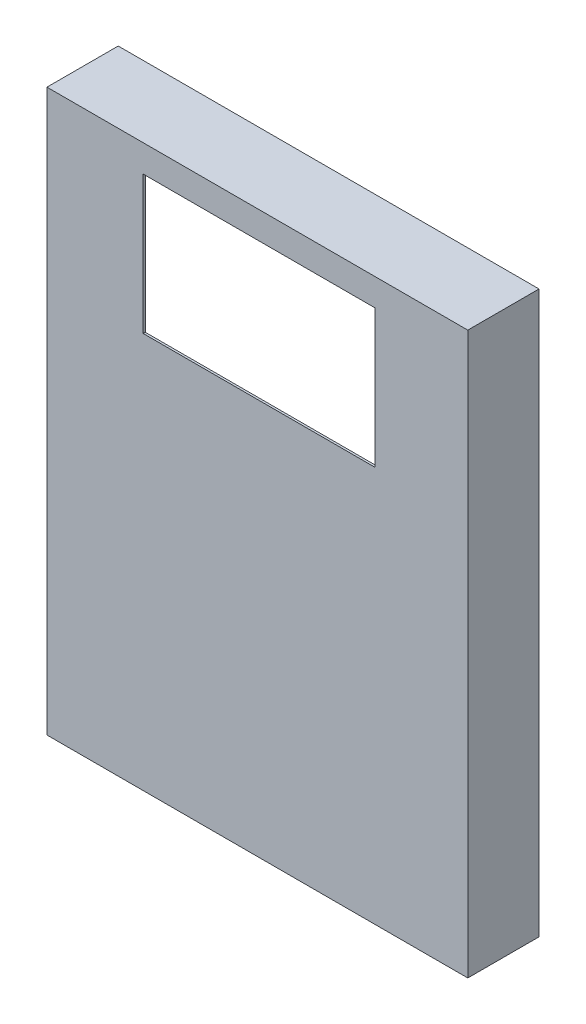
ISO-10303-21;
HEADER;
FILE_DESCRIPTION(('STEP AP214'),'2;1');
FILE_NAME('part.step','',(''),(''),'','','');
FILE_SCHEMA(('AUTOMOTIVE_DESIGN { 1 0 10303 214 1 1 1 1 }'));
ENDSEC;
DATA;
#1=APPLICATION_CONTEXT('core data for automotive mechanical design processes');
#2=APPLICATION_PROTOCOL_DEFINITION('international standard','automotive_design',2000,#1);
#3=PRODUCT_CONTEXT('',#1,'mechanical');
#4=PRODUCT('Part','Part','',(#3));
#5=PRODUCT_RELATED_PRODUCT_CATEGORY('part','',(#4));
#6=PRODUCT_DEFINITION_FORMATION('','',#4);
#7=PRODUCT_DEFINITION_CONTEXT('part definition',#1,'design');
#8=PRODUCT_DEFINITION('design','',#6,#7);
#9=PRODUCT_DEFINITION_SHAPE('','',#8);
#10=(LENGTH_UNIT() NAMED_UNIT(*) SI_UNIT(.MILLI.,.METRE.));
#11=(NAMED_UNIT(*) PLANE_ANGLE_UNIT() SI_UNIT($,.RADIAN.));
#12=(NAMED_UNIT(*) SI_UNIT($,.STERADIAN.) SOLID_ANGLE_UNIT());
#13=UNCERTAINTY_MEASURE_WITH_UNIT(LENGTH_MEASURE(1.E-05),#10,'distance_accuracy_value','');
#14=(GEOMETRIC_REPRESENTATION_CONTEXT(3) GLOBAL_UNCERTAINTY_ASSIGNED_CONTEXT((#13)) GLOBAL_UNIT_ASSIGNED_CONTEXT((#10,
#11,#12)) REPRESENTATION_CONTEXT('',''));
#15=CARTESIAN_POINT('',(0.,0.,0.));
#16=DIRECTION('',(0.,0.,1.));
#17=DIRECTION('',(1.,0.,0.));
#18=AXIS2_PLACEMENT_3D('',#15,#16,#17);
#19=CARTESIAN_POINT('',(0.,0.,0.));
#20=DIRECTION('',(0.,0.,-1.));
#21=DIRECTION('',(-1.,0.,0.));
#22=AXIS2_PLACEMENT_3D('',#19,#20,#21);
#23=PLANE('',#22);
#24=DIRECTION('',(0.,1.,0.));
#25=VECTOR('',#24,1.);
#26=CARTESIAN_POINT('',(150.,-200.,0.));
#27=LINE('',#26,#25);
#28=CARTESIAN_POINT('',(150.,-200.,0.));
#29=VERTEX_POINT('',#28);
#30=CARTESIAN_POINT('',(150.,200.,0.));
#31=VERTEX_POINT('',#30);
#32=EDGE_CURVE('E171',#29,#31,#27,.T.);
#33=ORIENTED_EDGE('',*,*,#32,.F.);
#34=DIRECTION('',(1.,0.,0.));
#35=VECTOR('',#34,1.);
#36=CARTESIAN_POINT('',(-150.,-200.,0.));
#37=LINE('',#36,#35);
#38=CARTESIAN_POINT('',(-150.,-200.,0.));
#39=VERTEX_POINT('',#38);
#40=EDGE_CURVE('E215',#39,#29,#37,.T.);
#41=ORIENTED_EDGE('',*,*,#40,.F.);
#42=DIRECTION('',(0.,-1.,0.));
#43=VECTOR('',#42,1.);
#44=CARTESIAN_POINT('',(-150.,-200.,0.));
#45=LINE('',#44,#43);
#46=CARTESIAN_POINT('',(-150.,200.,0.));
#47=VERTEX_POINT('',#46);
#48=EDGE_CURVE('E231',#47,#39,#45,.T.);
#49=ORIENTED_EDGE('',*,*,#48,.F.);
#50=DIRECTION('',(-1.,0.,0.));
#51=VECTOR('',#50,1.);
#52=CARTESIAN_POINT('',(-150.,200.,0.));
#53=LINE('',#52,#51);
#54=EDGE_CURVE('E228',#31,#47,#53,.T.);
#55=ORIENTED_EDGE('',*,*,#54,.F.);
#56=EDGE_LOOP('',(#33,#41,#49,#55));
#57=FACE_BOUND('',#56,.T.);
#58=DIRECTION('',(1.,0.,0.));
#59=VECTOR('',#58,1.);
#60=CARTESIAN_POINT('',(0.,-198.499999952,0.));
#61=LINE('',#60,#59);
#62=CARTESIAN_POINT('',(-148.499999952,-198.499999952,0.));
#63=VERTEX_POINT('',#62);
#64=CARTESIAN_POINT('',(148.499999952,-198.499999952,0.));
#65=VERTEX_POINT('',#64);
#66=EDGE_CURVE('E178',#63,#65,#61,.T.);
#67=ORIENTED_EDGE('',*,*,#66,.T.);
#68=DIRECTION('',(0.,1.,0.));
#69=VECTOR('',#68,1.);
#70=CARTESIAN_POINT('',(148.499999952,0.,0.));
#71=LINE('',#70,#69);
#72=CARTESIAN_POINT('',(148.499999952,198.499999952,0.));
#73=VERTEX_POINT('',#72);
#74=EDGE_CURVE('E162',#65,#73,#71,.T.);
#75=ORIENTED_EDGE('',*,*,#74,.T.);
#76=DIRECTION('',(-1.,0.,0.));
#77=VECTOR('',#76,1.);
#78=CARTESIAN_POINT('',(0.,198.499999952,0.));
#79=LINE('',#78,#77);
#80=CARTESIAN_POINT('',(-148.499999952,198.499999952,0.));
#81=VERTEX_POINT('',#80);
#82=EDGE_CURVE('E199',#73,#81,#79,.T.);
#83=ORIENTED_EDGE('',*,*,#82,.T.);
#84=DIRECTION('',(0.,-1.,0.));
#85=VECTOR('',#84,1.);
#86=CARTESIAN_POINT('',(-148.499999952,0.,0.));
#87=LINE('',#86,#85);
#88=EDGE_CURVE('E203',#81,#63,#87,.T.);
#89=ORIENTED_EDGE('',*,*,#88,.T.);
#90=EDGE_LOOP('',(#67,#75,#83,#89));
#91=FACE_BOUND('',#90,.T.);
#92=ADVANCED_FACE('F42',(#57,#91),#23,.T.);
#93=CARTESIAN_POINT('',(150.,-200.,50.8));
#94=DIRECTION('',(-1.,0.,0.));
#95=DIRECTION('',(0.,0.,1.));
#96=AXIS2_PLACEMENT_3D('',#93,#94,#95);
#97=PLANE('',#96);
#98=ORIENTED_EDGE('',*,*,#32,.T.);
#99=DIRECTION('',(0.,0.,-1.));
#100=VECTOR('',#99,1.);
#101=CARTESIAN_POINT('',(150.,200.,50.8));
#102=LINE('',#101,#100);
#103=CARTESIAN_POINT('',(150.,200.,50.8));
#104=VERTEX_POINT('',#103);
#105=EDGE_CURVE('E247',#104,#31,#102,.T.);
#106=ORIENTED_EDGE('',*,*,#105,.F.);
#107=DIRECTION('',(0.,1.,0.));
#108=VECTOR('',#107,1.);
#109=CARTESIAN_POINT('',(150.,-200.,50.8));
#110=LINE('',#109,#108);
#111=CARTESIAN_POINT('',(150.,-200.,50.8));
#112=VERTEX_POINT('',#111);
#113=EDGE_CURVE('E210',#112,#104,#110,.T.);
#114=ORIENTED_EDGE('',*,*,#113,.F.);
#115=DIRECTION('',(0.,0.,-1.));
#116=VECTOR('',#115,1.);
#117=CARTESIAN_POINT('',(150.,-200.,50.8));
#118=LINE('',#117,#116);
#119=EDGE_CURVE('E224',#112,#29,#118,.T.);
#120=ORIENTED_EDGE('',*,*,#119,.T.);
#121=EDGE_LOOP('',(#98,#106,#114,#120));
#122=FACE_BOUND('',#121,.T.);
#123=ADVANCED_FACE('F44',(#122),#97,.F.);
#124=CARTESIAN_POINT('',(-150.,200.,50.8));
#125=DIRECTION('',(0.,-1.,0.));
#126=DIRECTION('',(0.,0.,-1.));
#127=AXIS2_PLACEMENT_3D('',#124,#125,#126);
#128=PLANE('',#127);
#129=ORIENTED_EDGE('',*,*,#54,.T.);
#130=DIRECTION('',(0.,0.,-1.));
#131=VECTOR('',#130,1.);
#132=CARTESIAN_POINT('',(-150.,200.,50.8));
#133=LINE('',#132,#131);
#134=CARTESIAN_POINT('',(-150.,200.,50.8));
#135=VERTEX_POINT('',#134);
#136=EDGE_CURVE('E243',#135,#47,#133,.T.);
#137=ORIENTED_EDGE('',*,*,#136,.F.);
#138=DIRECTION('',(-1.,0.,0.));
#139=VECTOR('',#138,1.);
#140=CARTESIAN_POINT('',(-150.,200.,50.8));
#141=LINE('',#140,#139);
#142=EDGE_CURVE('E214',#104,#135,#141,.T.);
#143=ORIENTED_EDGE('',*,*,#142,.F.);
#144=ORIENTED_EDGE('',*,*,#105,.T.);
#145=EDGE_LOOP('',(#129,#137,#143,#144));
#146=FACE_BOUND('',#145,.T.);
#147=ADVANCED_FACE('F283',(#146),#128,.F.);
#148=CARTESIAN_POINT('',(-150.,-200.,50.8));
#149=DIRECTION('',(1.,0.,0.));
#150=DIRECTION('',(0.,0.,-1.));
#151=AXIS2_PLACEMENT_3D('',#148,#149,#150);
#152=PLANE('',#151);
#153=ORIENTED_EDGE('',*,*,#48,.T.);
#154=DIRECTION('',(0.,0.,-1.));
#155=VECTOR('',#154,1.);
#156=CARTESIAN_POINT('',(-150.,-200.,50.8));
#157=LINE('',#156,#155);
#158=CARTESIAN_POINT('',(-150.,-200.,50.8));
#159=VERTEX_POINT('',#158);
#160=EDGE_CURVE('E239',#159,#39,#157,.T.);
#161=ORIENTED_EDGE('',*,*,#160,.F.);
#162=DIRECTION('',(0.,-1.,0.));
#163=VECTOR('',#162,1.);
#164=CARTESIAN_POINT('',(-150.,-200.,50.8));
#165=LINE('',#164,#163);
#166=EDGE_CURVE('E218',#135,#159,#165,.T.);
#167=ORIENTED_EDGE('',*,*,#166,.F.);
#168=ORIENTED_EDGE('',*,*,#136,.T.);
#169=EDGE_LOOP('',(#153,#161,#167,#168));
#170=FACE_BOUND('',#169,.T.);
#171=ADVANCED_FACE('F292',(#170),#152,.F.);
#172=CARTESIAN_POINT('',(-150.,-200.,50.8));
#173=DIRECTION('',(0.,1.,0.));
#174=DIRECTION('',(0.,0.,1.));
#175=AXIS2_PLACEMENT_3D('',#172,#173,#174);
#176=PLANE('',#175);
#177=ORIENTED_EDGE('',*,*,#40,.T.);
#178=ORIENTED_EDGE('',*,*,#119,.F.);
#179=DIRECTION('',(1.,0.,0.));
#180=VECTOR('',#179,1.);
#181=CARTESIAN_POINT('',(-150.,-200.,50.8));
#182=LINE('',#181,#180);
#183=EDGE_CURVE('E221',#159,#112,#182,.T.);
#184=ORIENTED_EDGE('',*,*,#183,.F.);
#185=ORIENTED_EDGE('',*,*,#160,.T.);
#186=EDGE_LOOP('',(#177,#178,#184,#185));
#187=FACE_BOUND('',#186,.T.);
#188=ADVANCED_FACE('F289',(#187),#176,.F.);
#189=CARTESIAN_POINT('',(0.,0.,50.8));
#190=DIRECTION('',(0.,0.,-1.));
#191=DIRECTION('',(-1.,0.,0.));
#192=AXIS2_PLACEMENT_3D('',#189,#190,#191);
#193=PLANE('',#192);
#194=DIRECTION('',(1.,0.,0.));
#195=VECTOR('',#194,1.);
#196=CARTESIAN_POINT('',(-81.3989160864002,82.218368261767,50.8));
#197=LINE('',#196,#195);
#198=CARTESIAN_POINT('',(-81.3989160864002,82.218368261767,50.8));
#199=VERTEX_POINT('',#198);
#200=CARTESIAN_POINT('',(83.7010839135998,82.218368261767,50.8));
#201=VERTEX_POINT('',#200);
#202=EDGE_CURVE('E144',#199,#201,#197,.T.);
#203=ORIENTED_EDGE('',*,*,#202,.F.);
#204=DIRECTION('',(0.,-1.,0.));
#205=VECTOR('',#204,1.);
#206=CARTESIAN_POINT('',(-81.3989160864002,180.643368261767,50.8));
#207=LINE('',#206,#205);
#208=CARTESIAN_POINT('',(-81.3989160864002,180.643368261767,50.8));
#209=VERTEX_POINT('',#208);
#210=EDGE_CURVE('E58',#209,#199,#207,.T.);
#211=ORIENTED_EDGE('',*,*,#210,.F.);
#212=DIRECTION('',(1.,0.,0.));
#213=VECTOR('',#212,1.);
#214=CARTESIAN_POINT('',(-81.3989160864002,180.643368261767,50.8));
#215=LINE('',#214,#213);
#216=CARTESIAN_POINT('',(83.7010839135998,180.643368261767,50.8));
#217=VERTEX_POINT('',#216);
#218=EDGE_CURVE('E152',#209,#217,#215,.T.);
#219=ORIENTED_EDGE('',*,*,#218,.T.);
#220=DIRECTION('',(0.,-1.,0.));
#221=VECTOR('',#220,1.);
#222=CARTESIAN_POINT('',(83.7010839135998,180.643368261767,50.8));
#223=LINE('',#222,#221);
#224=EDGE_CURVE('E134',#217,#201,#223,.T.);
#225=ORIENTED_EDGE('',*,*,#224,.T.);
#226=EDGE_LOOP('',(#203,#211,#219,#225));
#227=FACE_BOUND('',#226,.T.);
#228=ORIENTED_EDGE('',*,*,#113,.T.);
#229=ORIENTED_EDGE('',*,*,#142,.T.);
#230=ORIENTED_EDGE('',*,*,#166,.T.);
#231=ORIENTED_EDGE('',*,*,#183,.T.);
#232=EDGE_LOOP('',(#228,#229,#230,#231));
#233=FACE_BOUND('',#232,.T.);
#234=ADVANCED_FACE('F149',(#227,#233),#193,.F.);
#235=CARTESIAN_POINT('',(148.499999952,-200.,50.8));
#236=DIRECTION('',(-1.,0.,0.));
#237=DIRECTION('',(0.,0.,1.));
#238=AXIS2_PLACEMENT_3D('',#235,#236,#237);
#239=PLANE('',#238);
#240=ORIENTED_EDGE('',*,*,#74,.F.);
#241=DIRECTION('',(0.,0.,-1.));
#242=VECTOR('',#241,1.);
#243=CARTESIAN_POINT('',(148.499999952,-198.499999952,50.8));
#244=LINE('',#243,#242);
#245=CARTESIAN_POINT('',(148.499999952,-198.499999952,49.299999952));
#246=VERTEX_POINT('',#245);
#247=EDGE_CURVE('E179',#246,#65,#244,.T.);
#248=ORIENTED_EDGE('',*,*,#247,.F.);
#249=DIRECTION('',(0.,1.,0.));
#250=VECTOR('',#249,1.);
#251=CARTESIAN_POINT('',(148.499999952,0.,49.299999952));
#252=LINE('',#251,#250);
#253=CARTESIAN_POINT('',(148.499999952,198.499999952,49.299999952));
#254=VERTEX_POINT('',#253);
#255=EDGE_CURVE('E173',#246,#254,#252,.T.);
#256=ORIENTED_EDGE('',*,*,#255,.T.);
#257=DIRECTION('',(0.,0.,-1.));
#258=VECTOR('',#257,1.);
#259=CARTESIAN_POINT('',(148.499999952,198.499999952,50.8));
#260=LINE('',#259,#258);
#261=EDGE_CURVE('E167',#254,#73,#260,.T.);
#262=ORIENTED_EDGE('',*,*,#261,.T.);
#263=EDGE_LOOP('',(#240,#248,#256,#262));
#264=FACE_BOUND('',#263,.T.);
#265=ADVANCED_FACE('F310',(#264),#239,.T.);
#266=CARTESIAN_POINT('',(-150.,198.499999952,50.8));
#267=DIRECTION('',(0.,-1.,0.));
#268=DIRECTION('',(0.,0.,-1.));
#269=AXIS2_PLACEMENT_3D('',#266,#267,#268);
#270=PLANE('',#269);
#271=ORIENTED_EDGE('',*,*,#82,.F.);
#272=ORIENTED_EDGE('',*,*,#261,.F.);
#273=DIRECTION('',(-1.,0.,0.));
#274=VECTOR('',#273,1.);
#275=CARTESIAN_POINT('',(0.,198.499999952,49.299999952));
#276=LINE('',#275,#274);
#277=CARTESIAN_POINT('',(-148.499999952,198.499999952,49.299999952));
#278=VERTEX_POINT('',#277);
#279=EDGE_CURVE('E177',#254,#278,#276,.T.);
#280=ORIENTED_EDGE('',*,*,#279,.T.);
#281=DIRECTION('',(0.,0.,-1.));
#282=VECTOR('',#281,1.);
#283=CARTESIAN_POINT('',(-148.499999952,198.499999952,50.8));
#284=LINE('',#283,#282);
#285=EDGE_CURVE('E172',#278,#81,#284,.T.);
#286=ORIENTED_EDGE('',*,*,#285,.T.);
#287=EDGE_LOOP('',(#271,#272,#280,#286));
#288=FACE_BOUND('',#287,.T.);
#289=ADVANCED_FACE('F315',(#288),#270,.T.);
#290=CARTESIAN_POINT('',(-148.499999952,-200.,50.8));
#291=DIRECTION('',(1.,0.,0.));
#292=DIRECTION('',(0.,0.,-1.));
#293=AXIS2_PLACEMENT_3D('',#290,#291,#292);
#294=PLANE('',#293);
#295=ORIENTED_EDGE('',*,*,#88,.F.);
#296=ORIENTED_EDGE('',*,*,#285,.F.);
#297=DIRECTION('',(0.,-1.,0.));
#298=VECTOR('',#297,1.);
#299=CARTESIAN_POINT('',(-148.499999952,0.,49.299999952));
#300=LINE('',#299,#298);
#301=CARTESIAN_POINT('',(-148.499999952,-198.499999952,49.299999952));
#302=VERTEX_POINT('',#301);
#303=EDGE_CURVE('E189',#278,#302,#300,.T.);
#304=ORIENTED_EDGE('',*,*,#303,.T.);
#305=DIRECTION('',(0.,0.,-1.));
#306=VECTOR('',#305,1.);
#307=CARTESIAN_POINT('',(-148.499999952,-198.499999952,50.8));
#308=LINE('',#307,#306);
#309=EDGE_CURVE('E182',#302,#63,#308,.T.);
#310=ORIENTED_EDGE('',*,*,#309,.T.);
#311=EDGE_LOOP('',(#295,#296,#304,#310));
#312=FACE_BOUND('',#311,.T.);
#313=ADVANCED_FACE('F320',(#312),#294,.T.);
#314=CARTESIAN_POINT('',(-150.,-198.499999952,50.8));
#315=DIRECTION('',(0.,1.,0.));
#316=DIRECTION('',(0.,0.,1.));
#317=AXIS2_PLACEMENT_3D('',#314,#315,#316);
#318=PLANE('',#317);
#319=ORIENTED_EDGE('',*,*,#66,.F.);
#320=ORIENTED_EDGE('',*,*,#309,.F.);
#321=DIRECTION('',(1.,0.,0.));
#322=VECTOR('',#321,1.);
#323=CARTESIAN_POINT('',(0.,-198.499999952,49.299999952));
#324=LINE('',#323,#322);
#325=EDGE_CURVE('E183',#302,#246,#324,.T.);
#326=ORIENTED_EDGE('',*,*,#325,.T.);
#327=ORIENTED_EDGE('',*,*,#247,.T.);
#328=EDGE_LOOP('',(#319,#320,#326,#327));
#329=FACE_BOUND('',#328,.T.);
#330=ADVANCED_FACE('F273',(#329),#318,.T.);
#331=CARTESIAN_POINT('',(0.,0.,49.299999952));
#332=DIRECTION('',(0.,0.,-1.));
#333=DIRECTION('',(-1.,0.,0.));
#334=AXIS2_PLACEMENT_3D('',#331,#332,#333);
#335=PLANE('',#334);
#336=DIRECTION('',(0.,1.,0.));
#337=VECTOR('',#336,1.);
#338=CARTESIAN_POINT('',(-81.3989160864002,0.,49.299999952));
#339=LINE('',#338,#337);
#340=CARTESIAN_POINT('',(-81.3989160864002,82.218368261767,49.299999952));
#341=VERTEX_POINT('',#340);
#342=CARTESIAN_POINT('',(-81.3989160864002,180.643368261767,49.299999952));
#343=VERTEX_POINT('',#342);
#344=EDGE_CURVE('E11',#341,#343,#339,.T.);
#345=ORIENTED_EDGE('',*,*,#344,.F.);
#346=DIRECTION('',(-1.,0.,0.));
#347=VECTOR('',#346,1.);
#348=CARTESIAN_POINT('',(0.,82.218368261767,49.299999952));
#349=LINE('',#348,#347);
#350=CARTESIAN_POINT('',(83.7010839135998,82.218368261767,49.299999952));
#351=VERTEX_POINT('',#350);
#352=EDGE_CURVE('E251',#351,#341,#349,.T.);
#353=ORIENTED_EDGE('',*,*,#352,.F.);
#354=DIRECTION('',(0.,1.,0.));
#355=VECTOR('',#354,1.);
#356=CARTESIAN_POINT('',(83.7010839135998,0.,49.299999952));
#357=LINE('',#356,#355);
#358=CARTESIAN_POINT('',(83.7010839135998,180.643368261767,49.299999952));
#359=VERTEX_POINT('',#358);
#360=EDGE_CURVE('E137',#351,#359,#357,.T.);
#361=ORIENTED_EDGE('',*,*,#360,.T.);
#362=DIRECTION('',(-1.,0.,0.));
#363=VECTOR('',#362,1.);
#364=CARTESIAN_POINT('',(0.,180.643368261767,49.299999952));
#365=LINE('',#364,#363);
#366=EDGE_CURVE('E51',#359,#343,#365,.T.);
#367=ORIENTED_EDGE('',*,*,#366,.T.);
#368=EDGE_LOOP('',(#345,#353,#361,#367));
#369=FACE_BOUND('',#368,.T.);
#370=ORIENTED_EDGE('',*,*,#255,.F.);
#371=ORIENTED_EDGE('',*,*,#325,.F.);
#372=ORIENTED_EDGE('',*,*,#303,.F.);
#373=ORIENTED_EDGE('',*,*,#279,.F.);
#374=EDGE_LOOP('',(#370,#371,#372,#373));
#375=FACE_BOUND('',#374,.T.);
#376=ADVANCED_FACE('F259',(#369,#375),#335,.T.);
#377=CARTESIAN_POINT('',(-81.3989160864002,180.643368261767,0.));
#378=DIRECTION('',(-1.,0.,0.));
#379=DIRECTION('',(0.,0.,1.));
#380=AXIS2_PLACEMENT_3D('',#377,#378,#379);
#381=PLANE('',#380);
#382=ORIENTED_EDGE('',*,*,#344,.T.);
#383=DIRECTION('',(0.,0.,1.));
#384=VECTOR('',#383,1.);
#385=CARTESIAN_POINT('',(-81.3989160864002,180.643368261767,0.));
#386=LINE('',#385,#384);
#387=EDGE_CURVE('E159',#343,#209,#386,.T.);
#388=ORIENTED_EDGE('',*,*,#387,.T.);
#389=ORIENTED_EDGE('',*,*,#210,.T.);
#390=DIRECTION('',(0.,0.,1.));
#391=VECTOR('',#390,1.);
#392=CARTESIAN_POINT('',(-81.3989160864002,82.218368261767,0.));
#393=LINE('',#392,#391);
#394=EDGE_CURVE('E141',#341,#199,#393,.T.);
#395=ORIENTED_EDGE('',*,*,#394,.F.);
#396=EDGE_LOOP('',(#382,#388,#389,#395));
#397=FACE_BOUND('',#396,.T.);
#398=ADVANCED_FACE('F264',(#397),#381,.F.);
#399=CARTESIAN_POINT('',(-81.3989160864002,180.643368261767,0.));
#400=DIRECTION('',(0.,-1.,0.));
#401=DIRECTION('',(0.,0.,-1.));
#402=AXIS2_PLACEMENT_3D('',#399,#400,#401);
#403=PLANE('',#402);
#404=DIRECTION('',(0.,0.,1.));
#405=VECTOR('',#404,1.);
#406=CARTESIAN_POINT('',(83.7010839135998,180.643368261767,0.));
#407=LINE('',#406,#405);
#408=EDGE_CURVE('E140',#359,#217,#407,.T.);
#409=ORIENTED_EDGE('',*,*,#408,.T.);
#410=ORIENTED_EDGE('',*,*,#218,.F.);
#411=ORIENTED_EDGE('',*,*,#387,.F.);
#412=ORIENTED_EDGE('',*,*,#366,.F.);
#413=EDGE_LOOP('',(#409,#410,#411,#412));
#414=FACE_BOUND('',#413,.T.);
#415=ADVANCED_FACE('F263',(#414),#403,.T.);
#416=CARTESIAN_POINT('',(83.7010839135998,180.643368261767,0.));
#417=DIRECTION('',(-1.,0.,0.));
#418=DIRECTION('',(0.,0.,1.));
#419=AXIS2_PLACEMENT_3D('',#416,#417,#418);
#420=PLANE('',#419);
#421=DIRECTION('',(0.,0.,1.));
#422=VECTOR('',#421,1.);
#423=CARTESIAN_POINT('',(83.7010839135998,82.218368261767,0.));
#424=LINE('',#423,#422);
#425=EDGE_CURVE('E66',#351,#201,#424,.T.);
#426=ORIENTED_EDGE('',*,*,#425,.T.);
#427=ORIENTED_EDGE('',*,*,#224,.F.);
#428=ORIENTED_EDGE('',*,*,#408,.F.);
#429=ORIENTED_EDGE('',*,*,#360,.F.);
#430=EDGE_LOOP('',(#426,#427,#428,#429));
#431=FACE_BOUND('',#430,.T.);
#432=ADVANCED_FACE('F131',(#431),#420,.T.);
#433=CARTESIAN_POINT('',(-81.3989160864002,82.218368261767,0.));
#434=DIRECTION('',(0.,-1.,0.));
#435=DIRECTION('',(0.,0.,-1.));
#436=AXIS2_PLACEMENT_3D('',#433,#434,#435);
#437=PLANE('',#436);
#438=ORIENTED_EDGE('',*,*,#352,.T.);
#439=ORIENTED_EDGE('',*,*,#394,.T.);
#440=ORIENTED_EDGE('',*,*,#202,.T.);
#441=ORIENTED_EDGE('',*,*,#425,.F.);
#442=EDGE_LOOP('',(#438,#439,#440,#441));
#443=FACE_BOUND('',#442,.T.);
#444=ADVANCED_FACE('F145',(#443),#437,.F.);
#445=CLOSED_SHELL('',(#92,#123,#147,#171,#188,#234,#265,#289,#313,#330,#376,#398,#415,#432,#444));
#446=MANIFOLD_SOLID_BREP('B2',#445);
#447=ADVANCED_BREP_SHAPE_REPRESENTATION('',(#18,#446),#14);
#448=SHAPE_DEFINITION_REPRESENTATION(#9,#447);
ENDSEC;
END-ISO-10303-21;
